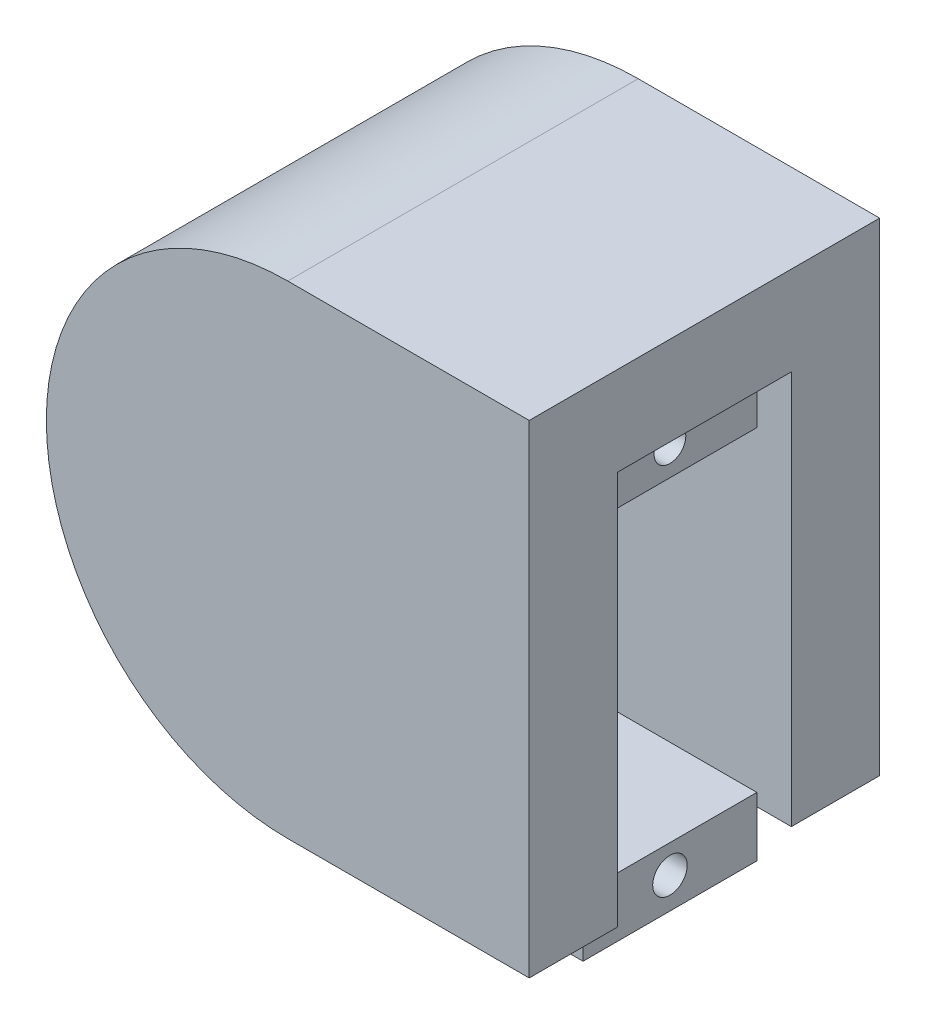
ISO-10303-21;
HEADER;
FILE_DESCRIPTION(('STEP AP214'),'2;1');
FILE_NAME('part.step','',(''),(''),'','','');
FILE_SCHEMA(('AUTOMOTIVE_DESIGN { 1 0 10303 214 1 1 1 1 }'));
ENDSEC;
DATA;
#1=APPLICATION_CONTEXT('core data for automotive mechanical design processes');
#2=APPLICATION_PROTOCOL_DEFINITION('international standard','automotive_design',2000,#1);
#3=PRODUCT_CONTEXT('',#1,'mechanical');
#4=PRODUCT('Part','Part','',(#3));
#5=PRODUCT_RELATED_PRODUCT_CATEGORY('part','',(#4));
#6=PRODUCT_DEFINITION_FORMATION('','',#4);
#7=PRODUCT_DEFINITION_CONTEXT('part definition',#1,'design');
#8=PRODUCT_DEFINITION('design','',#6,#7);
#9=PRODUCT_DEFINITION_SHAPE('','',#8);
#10=(LENGTH_UNIT() NAMED_UNIT(*) SI_UNIT(.MILLI.,.METRE.));
#11=(NAMED_UNIT(*) PLANE_ANGLE_UNIT() SI_UNIT($,.RADIAN.));
#12=(NAMED_UNIT(*) SI_UNIT($,.STERADIAN.) SOLID_ANGLE_UNIT());
#13=UNCERTAINTY_MEASURE_WITH_UNIT(LENGTH_MEASURE(1.E-05),#10,'distance_accuracy_value','');
#14=(GEOMETRIC_REPRESENTATION_CONTEXT(3) GLOBAL_UNCERTAINTY_ASSIGNED_CONTEXT((#13)) GLOBAL_UNIT_ASSIGNED_CONTEXT((#10,
#11,#12)) REPRESENTATION_CONTEXT('',''));
#15=CARTESIAN_POINT('',(0.,0.,0.));
#16=DIRECTION('',(0.,0.,1.));
#17=DIRECTION('',(1.,0.,0.));
#18=AXIS2_PLACEMENT_3D('',#15,#16,#17);
#19=CARTESIAN_POINT('',(17.5,-17.5,25.4));
#20=DIRECTION('',(0.,1.,0.));
#21=DIRECTION('',(0.,0.,1.));
#22=AXIS2_PLACEMENT_3D('',#19,#20,#21);
#23=PLANE('',#22);
#24=DIRECTION('',(1.,0.,0.));
#25=VECTOR('',#24,1.);
#26=CARTESIAN_POINT('',(2.36789803714361,-17.5,19.));
#27=LINE('',#26,#25);
#28=CARTESIAN_POINT('',(15.,-17.5,19.));
#29=VERTEX_POINT('',#28);
#30=CARTESIAN_POINT('',(17.5,-17.5,19.));
#31=VERTEX_POINT('',#30);
#32=EDGE_CURVE('E232',#29,#31,#27,.T.);
#33=ORIENTED_EDGE('',*,*,#32,.T.);
#34=DIRECTION('',(0.,0.,-1.));
#35=VECTOR('',#34,1.);
#36=CARTESIAN_POINT('',(17.5,-17.5,25.4));
#37=LINE('',#36,#35);
#38=CARTESIAN_POINT('',(17.5,-17.5,25.4));
#39=VERTEX_POINT('',#38);
#40=EDGE_CURVE('E239',#39,#31,#37,.T.);
#41=ORIENTED_EDGE('',*,*,#40,.F.);
#42=DIRECTION('',(-1.,0.,0.));
#43=VECTOR('',#42,1.);
#44=CARTESIAN_POINT('',(17.5,-17.5,25.4));
#45=LINE('',#44,#43);
#46=CARTESIAN_POINT('',(0.,-17.5,25.4));
#47=VERTEX_POINT('',#46);
#48=EDGE_CURVE('E270',#39,#47,#45,.T.);
#49=ORIENTED_EDGE('',*,*,#48,.T.);
#50=DIRECTION('',(0.,0.,-1.));
#51=VECTOR('',#50,1.);
#52=CARTESIAN_POINT('',(0.,-17.5,25.4));
#53=LINE('',#52,#51);
#54=CARTESIAN_POINT('',(0.,-17.5,0.));
#55=VERTEX_POINT('',#54);
#56=EDGE_CURVE('E256',#47,#55,#53,.T.);
#57=ORIENTED_EDGE('',*,*,#56,.T.);
#58=DIRECTION('',(-1.,0.,0.));
#59=VECTOR('',#58,1.);
#60=CARTESIAN_POINT('',(17.5,-17.5,0.));
#61=LINE('',#60,#59);
#62=CARTESIAN_POINT('',(17.5,-17.5,0.));
#63=VERTEX_POINT('',#62);
#64=EDGE_CURVE('E237',#63,#55,#61,.T.);
#65=ORIENTED_EDGE('',*,*,#64,.F.);
#66=CARTESIAN_POINT('',(17.5,-17.5,6.4));
#67=VERTEX_POINT('',#66);
#68=EDGE_CURVE('E215',#67,#63,#37,.T.);
#69=ORIENTED_EDGE('',*,*,#68,.F.);
#70=DIRECTION('',(1.,0.,0.));
#71=VECTOR('',#70,1.);
#72=CARTESIAN_POINT('',(2.36789803714361,-17.5,6.4));
#73=LINE('',#72,#71);
#74=CARTESIAN_POINT('',(15.,-17.5,6.4));
#75=VERTEX_POINT('',#74);
#76=EDGE_CURVE('E225',#75,#67,#73,.T.);
#77=ORIENTED_EDGE('',*,*,#76,.F.);
#78=DIRECTION('',(-1.,0.,0.));
#79=VECTOR('',#78,1.);
#80=CARTESIAN_POINT('',(17.5,-17.5,6.4));
#81=LINE('',#80,#79);
#82=CARTESIAN_POINT('',(8.60000000000002,-17.5,6.4));
#83=VERTEX_POINT('',#82);
#84=EDGE_CURVE('E365',#75,#83,#81,.T.);
#85=ORIENTED_EDGE('',*,*,#84,.T.);
#86=DIRECTION('',(0.,0.,1.));
#87=VECTOR('',#86,1.);
#88=CARTESIAN_POINT('',(8.60000000000002,-17.5,1.59167388793153));
#89=LINE('',#88,#87);
#90=CARTESIAN_POINT('',(8.60000000000002,-17.5,18.9999999999999));
#91=VERTEX_POINT('',#90);
#92=EDGE_CURVE('E393',#83,#91,#89,.T.);
#93=ORIENTED_EDGE('',*,*,#92,.T.);
#94=DIRECTION('',(-1.,0.,0.));
#95=VECTOR('',#94,1.);
#96=CARTESIAN_POINT('',(17.5,-17.5,19.));
#97=LINE('',#96,#95);
#98=EDGE_CURVE('E350',#29,#91,#97,.T.);
#99=ORIENTED_EDGE('',*,*,#98,.F.);
#100=EDGE_LOOP('',(#33,#41,#49,#57,#65,#69,#77,#85,#93,#99));
#101=FACE_BOUND('',#100,.T.);
#102=ADVANCED_FACE('F70',(#101),#23,.F.);
#103=CARTESIAN_POINT('',(17.5,0.,0.));
#104=DIRECTION('',(-1.,0.,0.));
#105=DIRECTION('',(0.,0.,1.));
#106=AXIS2_PLACEMENT_3D('',#103,#104,#105);
#107=PLANE('',#106);
#108=ORIENTED_EDGE('',*,*,#40,.T.);
#109=DIRECTION('',(0.,-1.,0.));
#110=VECTOR('',#109,1.);
#111=CARTESIAN_POINT('',(17.5,0.,19.));
#112=LINE('',#111,#110);
#113=CARTESIAN_POINT('',(17.5,11.0500000000001,19.));
#114=VERTEX_POINT('',#113);
#115=EDGE_CURVE('E295',#114,#31,#112,.T.);
#116=ORIENTED_EDGE('',*,*,#115,.F.);
#117=DIRECTION('',(0.,0.,-1.));
#118=VECTOR('',#117,1.);
#119=CARTESIAN_POINT('',(17.5,11.0500000000001,0.));
#120=LINE('',#119,#118);
#121=CARTESIAN_POINT('',(17.5,11.0500000000001,6.4));
#122=VERTEX_POINT('',#121);
#123=EDGE_CURVE('E219',#114,#122,#120,.T.);
#124=ORIENTED_EDGE('',*,*,#123,.T.);
#125=DIRECTION('',(0.,-1.,0.));
#126=VECTOR('',#125,1.);
#127=CARTESIAN_POINT('',(17.5,0.,6.4));
#128=LINE('',#127,#126);
#129=EDGE_CURVE('E210',#122,#67,#128,.T.);
#130=ORIENTED_EDGE('',*,*,#129,.T.);
#131=ORIENTED_EDGE('',*,*,#68,.T.);
#132=DIRECTION('',(0.,1.,0.));
#133=VECTOR('',#132,1.);
#134=CARTESIAN_POINT('',(17.5,-17.5,0.));
#135=LINE('',#134,#133);
#136=CARTESIAN_POINT('',(17.5,17.5,0.));
#137=VERTEX_POINT('',#136);
#138=EDGE_CURVE('E244',#63,#137,#135,.T.);
#139=ORIENTED_EDGE('',*,*,#138,.T.);
#140=DIRECTION('',(0.,0.,1.));
#141=VECTOR('',#140,1.);
#142=CARTESIAN_POINT('',(17.5,17.5,25.4));
#143=LINE('',#142,#141);
#144=CARTESIAN_POINT('',(17.5,17.5,25.4));
#145=VERTEX_POINT('',#144);
#146=EDGE_CURVE('E252',#137,#145,#143,.T.);
#147=ORIENTED_EDGE('',*,*,#146,.T.);
#148=DIRECTION('',(0.,-1.,0.));
#149=VECTOR('',#148,1.);
#150=CARTESIAN_POINT('',(17.5,-17.5,25.4));
#151=LINE('',#150,#149);
#152=EDGE_CURVE('E240',#145,#39,#151,.T.);
#153=ORIENTED_EDGE('',*,*,#152,.T.);
#154=EDGE_LOOP('',(#108,#116,#124,#130,#131,#139,#147,#153));
#155=FACE_BOUND('',#154,.T.);
#156=ADVANCED_FACE('F213',(#155),#107,.F.);
#157=CARTESIAN_POINT('',(-15.3855640066134,-16.5999999999999,0.));
#158=DIRECTION('',(0.,-1.,0.));
#159=DIRECTION('',(0.,0.,-1.));
#160=AXIS2_PLACEMENT_3D('',#157,#158,#159);
#161=PLANE('',#160);
#162=DIRECTION('',(0.,0.,-1.));
#163=VECTOR('',#162,1.);
#164=CARTESIAN_POINT('',(15.,-16.5999999999999,12.7));
#165=LINE('',#164,#163);
#166=CARTESIAN_POINT('',(15.,-16.5999999999999,19.));
#167=VERTEX_POINT('',#166);
#168=CARTESIAN_POINT('',(15.,-16.5999999999999,6.4));
#169=VERTEX_POINT('',#168);
#170=EDGE_CURVE('E91',#167,#169,#165,.T.);
#171=ORIENTED_EDGE('',*,*,#170,.T.);
#172=DIRECTION('',(1.,0.,0.));
#173=VECTOR('',#172,1.);
#174=CARTESIAN_POINT('',(-15.3855640066134,-16.5999999999999,6.4));
#175=LINE('',#174,#173);
#176=CARTESIAN_POINT('',(-1.5,-16.5999999999999,6.4));
#177=VERTEX_POINT('',#176);
#178=EDGE_CURVE('E306',#177,#169,#175,.T.);
#179=ORIENTED_EDGE('',*,*,#178,.F.);
#180=DIRECTION('',(0.,0.,1.));
#181=VECTOR('',#180,1.);
#182=CARTESIAN_POINT('',(-1.5,-16.5999999999999,0.));
#183=LINE('',#182,#181);
#184=CARTESIAN_POINT('',(-1.5,-16.5999999999999,19.));
#185=VERTEX_POINT('',#184);
#186=EDGE_CURVE('E353',#177,#185,#183,.T.);
#187=ORIENTED_EDGE('',*,*,#186,.T.);
#188=DIRECTION('',(1.,0.,0.));
#189=VECTOR('',#188,1.);
#190=CARTESIAN_POINT('',(-15.3855640066134,-16.5999999999999,19.));
#191=LINE('',#190,#189);
#192=EDGE_CURVE('E309',#185,#167,#191,.T.);
#193=ORIENTED_EDGE('',*,*,#192,.T.);
#194=EDGE_LOOP('',(#171,#179,#187,#193));
#195=FACE_BOUND('',#194,.T.);
#196=ADVANCED_FACE('F442',(#195),#161,.F.);
#197=CARTESIAN_POINT('',(15.,-5.14999999999994,12.7));
#198=DIRECTION('',(1.,0.,0.));
#199=DIRECTION('',(0.,-1.,0.));
#200=AXIS2_PLACEMENT_3D('',#197,#198,#199);
#201=PLANE('',#200);
#202=CARTESIAN_POINT('',(15.,8.35000000000005,12.7));
#203=DIRECTION('',(1.,0.,0.));
#204=DIRECTION('',(0.,0.,-1.));
#205=AXIS2_PLACEMENT_3D('',#202,#203,#204);
#206=CIRCLE('',#205,1.15);
#207=CARTESIAN_POINT('',(15.,8.35000000000005,11.55));
#208=VERTEX_POINT('',#207);
#209=EDGE_CURVE('E74',#208,#208,#206,.T.);
#210=ORIENTED_EDGE('',*,*,#209,.F.);
#211=EDGE_LOOP('',(#210));
#212=FACE_BOUND('',#211,.T.);
#213=DIRECTION('',(0.,1.,0.));
#214=VECTOR('',#213,1.);
#215=CARTESIAN_POINT('',(15.,0.,19.));
#216=LINE('',#215,#214);
#217=CARTESIAN_POINT('',(15.,6.30000000000005,19.));
#218=VERTEX_POINT('',#217);
#219=CARTESIAN_POINT('',(15.,11.0500000000001,19.));
#220=VERTEX_POINT('',#219);
#221=EDGE_CURVE('E317',#218,#220,#216,.T.);
#222=ORIENTED_EDGE('',*,*,#221,.F.);
#223=DIRECTION('',(0.,0.,-1.));
#224=VECTOR('',#223,1.);
#225=CARTESIAN_POINT('',(15.,6.30000000000005,12.7));
#226=LINE('',#225,#224);
#227=CARTESIAN_POINT('',(15.,6.30000000000005,6.4));
#228=VERTEX_POINT('',#227);
#229=EDGE_CURVE('E339',#218,#228,#226,.T.);
#230=ORIENTED_EDGE('',*,*,#229,.T.);
#231=DIRECTION('',(0.,1.,0.));
#232=VECTOR('',#231,1.);
#233=CARTESIAN_POINT('',(15.,0.,6.4));
#234=LINE('',#233,#232);
#235=CARTESIAN_POINT('',(15.,11.0500000000001,6.4));
#236=VERTEX_POINT('',#235);
#237=EDGE_CURVE('E320',#228,#236,#234,.T.);
#238=ORIENTED_EDGE('',*,*,#237,.T.);
#239=DIRECTION('',(0.,0.,1.));
#240=VECTOR('',#239,1.);
#241=CARTESIAN_POINT('',(15.,11.0500000000001,0.));
#242=LINE('',#241,#240);
#243=EDGE_CURVE('E308',#236,#220,#242,.T.);
#244=ORIENTED_EDGE('',*,*,#243,.T.);
#245=EDGE_LOOP('',(#222,#230,#238,#244));
#246=FACE_BOUND('',#245,.T.);
#247=ADVANCED_FACE('F455',(#212,#246),#201,.T.);
#248=CARTESIAN_POINT('',(0.,0.,25.4));
#249=DIRECTION('',(0.,0.,-1.));
#250=DIRECTION('',(-1.,0.,0.));
#251=AXIS2_PLACEMENT_3D('',#248,#249,#250);
#252=CYLINDRICAL_SURFACE('',#251,17.5);
#253=CARTESIAN_POINT('',(0.,0.,25.4));
#254=DIRECTION('',(0.,0.,1.));
#255=DIRECTION('',(1.,0.,0.));
#256=AXIS2_PLACEMENT_3D('',#253,#254,#255);
#257=CIRCLE('',#256,17.5);
#258=CARTESIAN_POINT('',(0.,17.5,25.4));
#259=VERTEX_POINT('',#258);
#260=EDGE_CURVE('E12',#259,#47,#257,.T.);
#261=ORIENTED_EDGE('',*,*,#260,.F.);
#262=DIRECTION('',(0.,0.,1.));
#263=VECTOR('',#262,1.);
#264=CARTESIAN_POINT('',(0.,17.5,25.4));
#265=LINE('',#264,#263);
#266=CARTESIAN_POINT('',(0.,17.5,0.));
#267=VERTEX_POINT('',#266);
#268=EDGE_CURVE('E246',#267,#259,#265,.T.);
#269=ORIENTED_EDGE('',*,*,#268,.F.);
#270=CARTESIAN_POINT('',(0.,0.,0.));
#271=DIRECTION('',(0.,0.,1.));
#272=DIRECTION('',(1.,0.,0.));
#273=AXIS2_PLACEMENT_3D('',#270,#271,#272);
#274=CIRCLE('',#273,17.5);
#275=EDGE_CURVE('E80',#267,#55,#274,.T.);
#276=ORIENTED_EDGE('',*,*,#275,.T.);
#277=ORIENTED_EDGE('',*,*,#56,.F.);
#278=EDGE_LOOP('',(#261,#269,#276,#277));
#279=FACE_BOUND('',#278,.T.);
#280=ADVANCED_FACE('F72',(#279),#252,.T.);
#281=CARTESIAN_POINT('',(0.,0.,25.4));
#282=DIRECTION('',(0.,0.,1.));
#283=DIRECTION('',(1.,0.,0.));
#284=AXIS2_PLACEMENT_3D('',#281,#282,#283);
#285=PLANE('',#284);
#286=ORIENTED_EDGE('',*,*,#260,.T.);
#287=ORIENTED_EDGE('',*,*,#48,.F.);
#288=ORIENTED_EDGE('',*,*,#152,.F.);
#289=DIRECTION('',(-1.,0.,0.));
#290=VECTOR('',#289,1.);
#291=CARTESIAN_POINT('',(17.5,17.5,25.4));
#292=LINE('',#291,#290);
#293=EDGE_CURVE('E255',#145,#259,#292,.T.);
#294=ORIENTED_EDGE('',*,*,#293,.T.);
#295=EDGE_LOOP('',(#286,#287,#288,#294));
#296=FACE_BOUND('',#295,.T.);
#297=ADVANCED_FACE('F292',(#296),#285,.T.);
#298=CARTESIAN_POINT('',(0.,0.,0.));
#299=DIRECTION('',(0.,0.,1.));
#300=DIRECTION('',(1.,0.,0.));
#301=AXIS2_PLACEMENT_3D('',#298,#299,#300);
#302=PLANE('',#301);
#303=ORIENTED_EDGE('',*,*,#275,.F.);
#304=DIRECTION('',(-1.,0.,0.));
#305=VECTOR('',#304,1.);
#306=CARTESIAN_POINT('',(17.5,17.5,0.));
#307=LINE('',#306,#305);
#308=EDGE_CURVE('E265',#137,#267,#307,.T.);
#309=ORIENTED_EDGE('',*,*,#308,.F.);
#310=ORIENTED_EDGE('',*,*,#138,.F.);
#311=ORIENTED_EDGE('',*,*,#64,.T.);
#312=EDGE_LOOP('',(#303,#309,#310,#311));
#313=FACE_BOUND('',#312,.T.);
#314=ADVANCED_FACE('F283',(#313),#302,.F.);
#315=CARTESIAN_POINT('',(17.5,17.5,25.4));
#316=DIRECTION('',(0.,-1.,0.));
#317=DIRECTION('',(0.,0.,-1.));
#318=AXIS2_PLACEMENT_3D('',#315,#316,#317);
#319=PLANE('',#318);
#320=ORIENTED_EDGE('',*,*,#268,.T.);
#321=ORIENTED_EDGE('',*,*,#293,.F.);
#322=ORIENTED_EDGE('',*,*,#146,.F.);
#323=ORIENTED_EDGE('',*,*,#308,.T.);
#324=EDGE_LOOP('',(#320,#321,#322,#323));
#325=FACE_BOUND('',#324,.T.);
#326=ADVANCED_FACE('F289',(#325),#319,.F.);
#327=ORIENTED_EDGE('',*,*,#170,.F.);
#328=DIRECTION('',(0.,-1.,0.));
#329=VECTOR('',#328,1.);
#330=CARTESIAN_POINT('',(15.,0.,18.9999999999999));
#331=LINE('',#330,#329);
#332=EDGE_CURVE('E404',#167,#29,#331,.T.);
#333=ORIENTED_EDGE('',*,*,#332,.T.);
#334=DIRECTION('',(0.,1.,0.));
#335=VECTOR('',#334,1.);
#336=CARTESIAN_POINT('',(15.,-5.14999999999992,19.));
#337=LINE('',#336,#335);
#338=CARTESIAN_POINT('',(15.,-20.8999999999999,19.));
#339=VERTEX_POINT('',#338);
#340=EDGE_CURVE('E381',#339,#29,#337,.T.);
#341=ORIENTED_EDGE('',*,*,#340,.F.);
#342=DIRECTION('',(0.,0.,-1.));
#343=VECTOR('',#342,1.);
#344=CARTESIAN_POINT('',(15.,-20.8999999999999,12.7));
#345=LINE('',#344,#343);
#346=CARTESIAN_POINT('',(15.,-20.8999999999999,6.4));
#347=VERTEX_POINT('',#346);
#348=EDGE_CURVE('E375',#339,#347,#345,.T.);
#349=ORIENTED_EDGE('',*,*,#348,.T.);
#350=DIRECTION('',(0.,1.,0.));
#351=VECTOR('',#350,1.);
#352=CARTESIAN_POINT('',(15.,-5.14999999999994,6.4));
#353=LINE('',#352,#351);
#354=EDGE_CURVE('E378',#347,#75,#353,.T.);
#355=ORIENTED_EDGE('',*,*,#354,.T.);
#356=DIRECTION('',(0.,-1.,0.));
#357=VECTOR('',#356,1.);
#358=CARTESIAN_POINT('',(15.,0.,6.4));
#359=LINE('',#358,#357);
#360=EDGE_CURVE('E228',#169,#75,#359,.T.);
#361=ORIENTED_EDGE('',*,*,#360,.F.);
#362=EDGE_LOOP('',(#327,#333,#341,#349,#355,#361));
#363=FACE_BOUND('',#362,.T.);
#364=CARTESIAN_POINT('',(15.,-18.6499999999999,12.7));
#365=DIRECTION('',(1.,0.,0.));
#366=DIRECTION('',(0.,-0.916515138991168,-0.4));
#367=AXIS2_PLACEMENT_3D('',#364,#365,#366);
#368=CIRCLE('',#367,1.25);
#369=CARTESIAN_POINT('',(15.,-19.7956439237389,12.2));
#370=VERTEX_POINT('',#369);
#371=EDGE_CURVE('E259',#370,#370,#368,.T.);
#372=ORIENTED_EDGE('',*,*,#371,.F.);
#373=EDGE_LOOP('',(#372));
#374=FACE_BOUND('',#373,.T.);
#375=ADVANCED_FACE('F410',(#363,#374),#201,.T.);
#376=CARTESIAN_POINT('',(-15.3855640066134,11.0500000000001,0.));
#377=DIRECTION('',(0.,-1.,0.));
#378=DIRECTION('',(0.,0.,-1.));
#379=AXIS2_PLACEMENT_3D('',#376,#377,#378);
#380=PLANE('',#379);
#381=DIRECTION('',(1.,0.,0.));
#382=VECTOR('',#381,1.);
#383=CARTESIAN_POINT('',(-15.3855640066134,11.0500000000001,6.4));
#384=LINE('',#383,#382);
#385=EDGE_CURVE('E297',#236,#122,#384,.T.);
#386=ORIENTED_EDGE('',*,*,#385,.T.);
#387=ORIENTED_EDGE('',*,*,#123,.F.);
#388=DIRECTION('',(1.,0.,0.));
#389=VECTOR('',#388,1.);
#390=CARTESIAN_POINT('',(-15.3855640066134,11.0500000000001,19.));
#391=LINE('',#390,#389);
#392=EDGE_CURVE('E302',#220,#114,#391,.T.);
#393=ORIENTED_EDGE('',*,*,#392,.F.);
#394=ORIENTED_EDGE('',*,*,#243,.F.);
#395=EDGE_LOOP('',(#386,#387,#393,#394));
#396=FACE_BOUND('',#395,.T.);
#397=ADVANCED_FACE('F453',(#396),#380,.T.);
#398=CARTESIAN_POINT('',(-15.3855640066134,0.,19.));
#399=DIRECTION('',(0.,0.,1.));
#400=DIRECTION('',(0.,-1.,0.));
#401=AXIS2_PLACEMENT_3D('',#398,#399,#400);
#402=PLANE('',#401);
#403=ORIENTED_EDGE('',*,*,#192,.F.);
#404=DIRECTION('',(0.,1.,0.));
#405=VECTOR('',#404,1.);
#406=CARTESIAN_POINT('',(-1.5,0.,19.));
#407=LINE('',#406,#405);
#408=CARTESIAN_POINT('',(-1.5,6.30000000000005,19.));
#409=VERTEX_POINT('',#408);
#410=EDGE_CURVE('E343',#185,#409,#407,.T.);
#411=ORIENTED_EDGE('',*,*,#410,.T.);
#412=DIRECTION('',(1.,0.,0.));
#413=VECTOR('',#412,1.);
#414=CARTESIAN_POINT('',(-27.637520922995,6.30000000000005,19.));
#415=LINE('',#414,#413);
#416=EDGE_CURVE('E102',#409,#218,#415,.T.);
#417=ORIENTED_EDGE('',*,*,#416,.T.);
#418=ORIENTED_EDGE('',*,*,#221,.T.);
#419=ORIENTED_EDGE('',*,*,#392,.T.);
#420=ORIENTED_EDGE('',*,*,#115,.T.);
#421=ORIENTED_EDGE('',*,*,#32,.F.);
#422=ORIENTED_EDGE('',*,*,#332,.F.);
#423=EDGE_LOOP('',(#403,#411,#417,#418,#419,#420,#421,#422));
#424=FACE_BOUND('',#423,.T.);
#425=ADVANCED_FACE('F413',(#424),#402,.F.);
#426=CARTESIAN_POINT('',(-15.3855640066134,0.,6.4));
#427=DIRECTION('',(0.,0.,1.));
#428=DIRECTION('',(0.,-1.,0.));
#429=AXIS2_PLACEMENT_3D('',#426,#427,#428);
#430=PLANE('',#429);
#431=ORIENTED_EDGE('',*,*,#178,.T.);
#432=ORIENTED_EDGE('',*,*,#360,.T.);
#433=ORIENTED_EDGE('',*,*,#76,.T.);
#434=ORIENTED_EDGE('',*,*,#129,.F.);
#435=ORIENTED_EDGE('',*,*,#385,.F.);
#436=ORIENTED_EDGE('',*,*,#237,.F.);
#437=DIRECTION('',(1.,0.,0.));
#438=VECTOR('',#437,1.);
#439=CARTESIAN_POINT('',(-27.637520922995,6.30000000000005,6.4));
#440=LINE('',#439,#438);
#441=CARTESIAN_POINT('',(-1.5,6.30000000000005,6.4));
#442=VERTEX_POINT('',#441);
#443=EDGE_CURVE('E349',#442,#228,#440,.T.);
#444=ORIENTED_EDGE('',*,*,#443,.F.);
#445=DIRECTION('',(0.,1.,0.));
#446=VECTOR('',#445,1.);
#447=CARTESIAN_POINT('',(-1.5,0.,6.4));
#448=LINE('',#447,#446);
#449=EDGE_CURVE('E357',#177,#442,#448,.T.);
#450=ORIENTED_EDGE('',*,*,#449,.F.);
#451=EDGE_LOOP('',(#431,#432,#433,#434,#435,#436,#444,#450));
#452=FACE_BOUND('',#451,.T.);
#453=ADVANCED_FACE('F227',(#452),#430,.T.);
#454=CARTESIAN_POINT('',(10.5,8.35000000000005,12.7));
#455=DIRECTION('',(1.,0.,0.));
#456=DIRECTION('',(0.,0.,-1.));
#457=AXIS2_PLACEMENT_3D('',#454,#455,#456);
#458=CYLINDRICAL_SURFACE('',#457,1.15);
#459=ORIENTED_EDGE('',*,*,#209,.T.);
#460=EDGE_LOOP('',(#459));
#461=FACE_BOUND('',#460,.T.);
#462=CARTESIAN_POINT('',(10.5,8.35000000000005,12.7));
#463=DIRECTION('',(1.,0.,0.));
#464=DIRECTION('',(0.,0.,-1.));
#465=AXIS2_PLACEMENT_3D('',#462,#463,#464);
#466=CIRCLE('',#465,1.15);
#467=CARTESIAN_POINT('',(10.5,8.35000000000005,11.55));
#468=VERTEX_POINT('',#467);
#469=EDGE_CURVE('E335',#468,#468,#466,.T.);
#470=ORIENTED_EDGE('',*,*,#469,.F.);
#471=EDGE_LOOP('',(#470));
#472=FACE_BOUND('',#471,.T.);
#473=ADVANCED_FACE('F492',(#461,#472),#458,.F.);
#474=CARTESIAN_POINT('',(10.5,0.,0.));
#475=DIRECTION('',(1.,0.,0.));
#476=DIRECTION('',(0.,0.,-1.));
#477=AXIS2_PLACEMENT_3D('',#474,#475,#476);
#478=PLANE('',#477);
#479=ORIENTED_EDGE('',*,*,#469,.T.);
#480=EDGE_LOOP('',(#479));
#481=FACE_BOUND('',#480,.T.);
#482=ADVANCED_FACE('F490',(#481),#478,.T.);
#483=CARTESIAN_POINT('',(-27.637520922995,6.30000000000005,0.));
#484=DIRECTION('',(0.,-1.,0.));
#485=DIRECTION('',(0.,0.,-1.));
#486=AXIS2_PLACEMENT_3D('',#483,#484,#485);
#487=PLANE('',#486);
#488=ORIENTED_EDGE('',*,*,#416,.F.);
#489=DIRECTION('',(0.,0.,1.));
#490=VECTOR('',#489,1.);
#491=CARTESIAN_POINT('',(-1.5,6.30000000000005,0.));
#492=LINE('',#491,#490);
#493=EDGE_CURVE('E346',#442,#409,#492,.T.);
#494=ORIENTED_EDGE('',*,*,#493,.F.);
#495=ORIENTED_EDGE('',*,*,#443,.T.);
#496=ORIENTED_EDGE('',*,*,#229,.F.);
#497=EDGE_LOOP('',(#488,#494,#495,#496));
#498=FACE_BOUND('',#497,.T.);
#499=ADVANCED_FACE('F481',(#498),#487,.T.);
#500=CARTESIAN_POINT('',(-1.5,-5.14999999999999,12.7));
#501=DIRECTION('',(1.,0.,0.));
#502=DIRECTION('',(0.,-1.,0.));
#503=AXIS2_PLACEMENT_3D('',#500,#501,#502);
#504=PLANE('',#503);
#505=ORIENTED_EDGE('',*,*,#449,.T.);
#506=ORIENTED_EDGE('',*,*,#493,.T.);
#507=ORIENTED_EDGE('',*,*,#410,.F.);
#508=ORIENTED_EDGE('',*,*,#186,.F.);
#509=EDGE_LOOP('',(#505,#506,#507,#508));
#510=FACE_BOUND('',#509,.T.);
#511=ADVANCED_FACE('F484',(#510),#504,.T.);
#512=CARTESIAN_POINT('',(12.,-18.6499999999999,12.7));
#513=DIRECTION('',(1.,0.,0.));
#514=DIRECTION('',(0.,0.,-1.));
#515=AXIS2_PLACEMENT_3D('',#512,#513,#514);
#516=CYLINDRICAL_SURFACE('',#515,1.25);
#517=ORIENTED_EDGE('',*,*,#371,.T.);
#518=EDGE_LOOP('',(#517));
#519=FACE_BOUND('',#518,.T.);
#520=CARTESIAN_POINT('',(12.,-18.6499999999999,12.7));
#521=DIRECTION('',(1.,0.,0.));
#522=DIRECTION('',(0.,0.,-1.));
#523=AXIS2_PLACEMENT_3D('',#520,#521,#522);
#524=CIRCLE('',#523,1.25);
#525=CARTESIAN_POINT('',(12.,-18.6499999999999,11.45));
#526=VERTEX_POINT('',#525);
#527=EDGE_CURVE('E385',#526,#526,#524,.T.);
#528=ORIENTED_EDGE('',*,*,#527,.F.);
#529=EDGE_LOOP('',(#528));
#530=FACE_BOUND('',#529,.T.);
#531=ADVANCED_FACE('F485',(#519,#530),#516,.F.);
#532=CARTESIAN_POINT('',(12.,-5.14999999999992,19.));
#533=DIRECTION('',(0.,0.,-1.));
#534=DIRECTION('',(0.,1.,0.));
#535=AXIS2_PLACEMENT_3D('',#532,#533,#534);
#536=PLANE('',#535);
#537=ORIENTED_EDGE('',*,*,#340,.T.);
#538=ORIENTED_EDGE('',*,*,#98,.T.);
#539=DIRECTION('',(0.707106781186551,-0.707106781186544,0.));
#540=VECTOR('',#539,1.);
#541=CARTESIAN_POINT('',(12.,-20.8999999999999,18.9999999999999));
#542=LINE('',#541,#540);
#543=CARTESIAN_POINT('',(12.,-20.8999999999999,18.9999999999999));
#544=VERTEX_POINT('',#543);
#545=EDGE_CURVE('E397',#91,#544,#542,.T.);
#546=ORIENTED_EDGE('',*,*,#545,.T.);
#547=DIRECTION('',(1.,0.,0.));
#548=VECTOR('',#547,1.);
#549=CARTESIAN_POINT('',(12.,-20.8999999999999,19.));
#550=LINE('',#549,#548);
#551=EDGE_CURVE('E371',#544,#339,#550,.T.);
#552=ORIENTED_EDGE('',*,*,#551,.T.);
#553=EDGE_LOOP('',(#537,#538,#546,#552));
#554=FACE_BOUND('',#553,.T.);
#555=ADVANCED_FACE('F417',(#554),#536,.F.);
#556=CARTESIAN_POINT('',(12.,-5.14999999999994,6.4));
#557=DIRECTION('',(0.,0.,-1.));
#558=DIRECTION('',(-1.,0.,0.));
#559=AXIS2_PLACEMENT_3D('',#556,#557,#558);
#560=PLANE('',#559);
#561=ORIENTED_EDGE('',*,*,#84,.F.);
#562=ORIENTED_EDGE('',*,*,#354,.F.);
#563=DIRECTION('',(1.,0.,0.));
#564=VECTOR('',#563,1.);
#565=CARTESIAN_POINT('',(12.,-20.8999999999999,6.4));
#566=LINE('',#565,#564);
#567=CARTESIAN_POINT('',(12.,-20.8999999999999,6.4));
#568=VERTEX_POINT('',#567);
#569=EDGE_CURVE('E368',#568,#347,#566,.T.);
#570=ORIENTED_EDGE('',*,*,#569,.F.);
#571=DIRECTION('',(0.707106781186551,-0.707106781186544,0.));
#572=VECTOR('',#571,1.);
#573=CARTESIAN_POINT('',(12.,-20.8999999999999,6.4));
#574=LINE('',#573,#572);
#575=EDGE_CURVE('E392',#83,#568,#574,.T.);
#576=ORIENTED_EDGE('',*,*,#575,.F.);
#577=EDGE_LOOP('',(#561,#562,#570,#576));
#578=FACE_BOUND('',#577,.T.);
#579=ADVANCED_FACE('F424',(#578),#560,.T.);
#580=CARTESIAN_POINT('',(12.,-20.8999999999999,12.7));
#581=DIRECTION('',(0.,-1.,0.));
#582=DIRECTION('',(0.,0.,-1.));
#583=AXIS2_PLACEMENT_3D('',#580,#581,#582);
#584=PLANE('',#583);
#585=ORIENTED_EDGE('',*,*,#348,.F.);
#586=ORIENTED_EDGE('',*,*,#551,.F.);
#587=DIRECTION('',(0.,0.,-1.));
#588=VECTOR('',#587,1.);
#589=CARTESIAN_POINT('',(12.,-20.8999999999999,12.7));
#590=LINE('',#589,#588);
#591=EDGE_CURVE('E374',#544,#568,#590,.T.);
#592=ORIENTED_EDGE('',*,*,#591,.T.);
#593=ORIENTED_EDGE('',*,*,#569,.T.);
#594=EDGE_LOOP('',(#585,#586,#592,#593));
#595=FACE_BOUND('',#594,.T.);
#596=ADVANCED_FACE('F420',(#595),#584,.T.);
#597=CARTESIAN_POINT('',(12.,0.,0.));
#598=DIRECTION('',(-1.,0.,0.));
#599=DIRECTION('',(0.,0.,1.));
#600=AXIS2_PLACEMENT_3D('',#597,#598,#599);
#601=PLANE('',#600);
#602=ORIENTED_EDGE('',*,*,#527,.T.);
#603=EDGE_LOOP('',(#602));
#604=FACE_BOUND('',#603,.T.);
#605=ADVANCED_FACE('F429',(#604),#601,.F.);
#606=CARTESIAN_POINT('',(12.,-20.8999999999999,1.59167388793153));
#607=DIRECTION('',(-0.707106781186544,-0.707106781186551,0.));
#608=DIRECTION('',(0.707106781186551,-0.707106781186544,0.));
#609=AXIS2_PLACEMENT_3D('',#606,#607,#608);
#610=PLANE('',#609);
#611=ORIENTED_EDGE('',*,*,#92,.F.);
#612=ORIENTED_EDGE('',*,*,#575,.T.);
#613=ORIENTED_EDGE('',*,*,#591,.F.);
#614=ORIENTED_EDGE('',*,*,#545,.F.);
#615=EDGE_LOOP('',(#611,#612,#613,#614));
#616=FACE_BOUND('',#615,.T.);
#617=ADVANCED_FACE('F427',(#616),#610,.T.);
#618=CLOSED_SHELL('',(#102,#156,#196,#247,#280,#297,#314,#326,#375,#397,#425,#453,#473,#482,
#499,#511,#531,#555,#579,#596,#605,#617));
#619=MANIFOLD_SOLID_BREP('B2',#618);
#620=ADVANCED_BREP_SHAPE_REPRESENTATION('',(#18,#619),#14);
#621=SHAPE_DEFINITION_REPRESENTATION(#9,#620);
ENDSEC;
END-ISO-10303-21;
